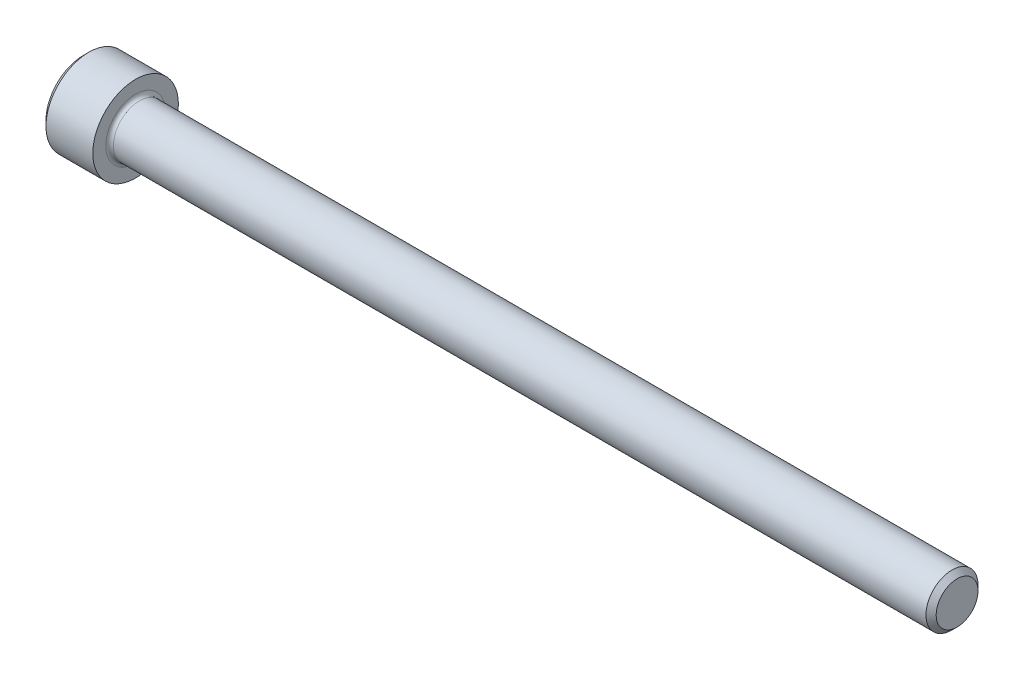
ISO-10303-21;
HEADER;
FILE_DESCRIPTION(('STEP AP214'),'2;1');
FILE_NAME('part.step','',(''),(''),'','','');
FILE_SCHEMA(('AUTOMOTIVE_DESIGN { 1 0 10303 214 1 1 1 1 }'));
ENDSEC;
DATA;
#1=APPLICATION_CONTEXT('core data for automotive mechanical design processes');
#2=APPLICATION_PROTOCOL_DEFINITION('international standard','automotive_design',2000,#1);
#3=PRODUCT_CONTEXT('',#1,'mechanical');
#4=PRODUCT('Part','Part','',(#3));
#5=PRODUCT_RELATED_PRODUCT_CATEGORY('part','',(#4));
#6=PRODUCT_DEFINITION_FORMATION('','',#4);
#7=PRODUCT_DEFINITION_CONTEXT('part definition',#1,'design');
#8=PRODUCT_DEFINITION('design','',#6,#7);
#9=PRODUCT_DEFINITION_SHAPE('','',#8);
#10=(LENGTH_UNIT() NAMED_UNIT(*) SI_UNIT(.MILLI.,.METRE.));
#11=(NAMED_UNIT(*) PLANE_ANGLE_UNIT() SI_UNIT($,.RADIAN.));
#12=(NAMED_UNIT(*) SI_UNIT($,.STERADIAN.) SOLID_ANGLE_UNIT());
#13=UNCERTAINTY_MEASURE_WITH_UNIT(LENGTH_MEASURE(1.E-05),#10,'distance_accuracy_value','');
#14=(GEOMETRIC_REPRESENTATION_CONTEXT(3) GLOBAL_UNCERTAINTY_ASSIGNED_CONTEXT((#13)) GLOBAL_UNIT_ASSIGNED_CONTEXT((#10,
#11,#12)) REPRESENTATION_CONTEXT('',''));
#15=CARTESIAN_POINT('',(0.,0.,0.));
#16=DIRECTION('',(0.,0.,1.));
#17=DIRECTION('',(1.,0.,0.));
#18=AXIS2_PLACEMENT_3D('',#15,#16,#17);
#19=CARTESIAN_POINT('',(2.286,1.14604605784411,1.98501));
#20=DIRECTION('',(-1.,0.,0.));
#21=DIRECTION('',(0.,0.,1.));
#22=AXIS2_PLACEMENT_3D('',#19,#20,#21);
#23=PLANE('',#22);
#24=DIRECTION('',(0.,0.5,0.866025403784439));
#25=VECTOR('',#24,1.);
#26=CARTESIAN_POINT('',(2.286,-1.71906908676614,0.992505));
#27=LINE('',#26,#25);
#28=CARTESIAN_POINT('',(2.285999999976,-1.71906908679011,0.99250500001384));
#29=VERTEX_POINT('',#28);
#30=CARTESIAN_POINT('',(2.286,-1.14604605784409,1.98501));
#31=VERTEX_POINT('',#30);
#32=EDGE_CURVE('E101',#29,#31,#27,.T.);
#33=ORIENTED_EDGE('',*,*,#32,.T.);
#34=DIRECTION('',(0.,1.,0.));
#35=VECTOR('',#34,1.);
#36=CARTESIAN_POINT('',(2.286,1.14604605784411,1.98501));
#37=LINE('',#36,#35);
#38=CARTESIAN_POINT('',(2.28600000001103,0.,1.98500999997046));
#39=VERTEX_POINT('',#38);
#40=EDGE_CURVE('E96',#31,#39,#37,.T.);
#41=ORIENTED_EDGE('',*,*,#40,.T.);
#42=CARTESIAN_POINT('',(2.285999999952,0.,0.));
#43=DIRECTION('',(-1.,0.,0.));
#44=DIRECTION('',(0.,0.,1.));
#45=AXIS2_PLACEMENT_3D('',#42,#43,#44);
#46=CIRCLE('',#45,1.98501000005535);
#47=EDGE_CURVE('E98',#39,#29,#46,.F.);
#48=ORIENTED_EDGE('',*,*,#47,.T.);
#49=EDGE_LOOP('',(#33,#41,#48));
#50=FACE_BOUND('',#49,.T.);
#51=ADVANCED_FACE('F17',(#50),#23,.T.);
#52=CARTESIAN_POINT('',(2.286,1.14604605784411,1.98501));
#53=DIRECTION('',(-1.,0.,0.));
#54=DIRECTION('',(0.,0.,1.));
#55=AXIS2_PLACEMENT_3D('',#52,#53,#54);
#56=PLANE('',#55);
#57=DIRECTION('',(0.,-0.5,0.866025403784439));
#58=VECTOR('',#57,1.);
#59=CARTESIAN_POINT('',(2.286,-1.71906908676615,-0.992505));
#60=LINE('',#59,#58);
#61=CARTESIAN_POINT('',(2.285999999976,-1.71906908679012,-0.992505000013838));
#62=VERTEX_POINT('',#61);
#63=CARTESIAN_POINT('',(2.286,-2.2920921156882,0.));
#64=VERTEX_POINT('',#63);
#65=EDGE_CURVE('E105',#62,#64,#60,.T.);
#66=ORIENTED_EDGE('',*,*,#65,.T.);
#67=DIRECTION('',(0.,0.500000000000008,0.866025403784434));
#68=VECTOR('',#67,1.);
#69=CARTESIAN_POINT('',(2.286,-2.2920921156882,0.));
#70=LINE('',#69,#68);
#71=EDGE_CURVE('E172',#64,#29,#70,.T.);
#72=ORIENTED_EDGE('',*,*,#71,.T.);
#73=CARTESIAN_POINT('',(2.285999999952,0.,0.));
#74=DIRECTION('',(-1.,0.,0.));
#75=DIRECTION('',(0.,0.,1.));
#76=AXIS2_PLACEMENT_3D('',#73,#74,#75);
#77=CIRCLE('',#76,1.98501000005535);
#78=EDGE_CURVE('E117',#29,#62,#77,.F.);
#79=ORIENTED_EDGE('',*,*,#78,.T.);
#80=EDGE_LOOP('',(#66,#72,#79));
#81=FACE_BOUND('',#80,.T.);
#82=ADVANCED_FACE('F348',(#81),#56,.T.);
#83=CARTESIAN_POINT('',(2.286,1.14604605784411,1.98501));
#84=DIRECTION('',(-1.,0.,0.));
#85=DIRECTION('',(0.,0.,1.));
#86=AXIS2_PLACEMENT_3D('',#83,#84,#85);
#87=PLANE('',#86);
#88=DIRECTION('',(0.,1.,0.));
#89=VECTOR('',#88,1.);
#90=CARTESIAN_POINT('',(2.286,1.14604605784411,-1.98501));
#91=LINE('',#90,#89);
#92=CARTESIAN_POINT('',(2.28600000001103,3.76757339419936E-12,-1.98500999997046));
#93=VERTEX_POINT('',#92);
#94=CARTESIAN_POINT('',(2.286,-1.1460460578441,-1.98501));
#95=VERTEX_POINT('',#94);
#96=EDGE_CURVE('E167',#93,#95,#91,.F.);
#97=ORIENTED_EDGE('',*,*,#96,.T.);
#98=DIRECTION('',(0.,-0.5,0.866025403784439));
#99=VECTOR('',#98,1.);
#100=CARTESIAN_POINT('',(2.286,-1.1460460578441,-1.98501));
#101=LINE('',#100,#99);
#102=EDGE_CURVE('E162',#95,#62,#101,.T.);
#103=ORIENTED_EDGE('',*,*,#102,.T.);
#104=CARTESIAN_POINT('',(2.285999999952,0.,0.));
#105=DIRECTION('',(-1.,0.,0.));
#106=DIRECTION('',(0.,0.,1.));
#107=AXIS2_PLACEMENT_3D('',#104,#105,#106);
#108=CIRCLE('',#107,1.98501000005535);
#109=EDGE_CURVE('E225',#62,#93,#108,.F.);
#110=ORIENTED_EDGE('',*,*,#109,.T.);
#111=EDGE_LOOP('',(#97,#103,#110));
#112=FACE_BOUND('',#111,.T.);
#113=ADVANCED_FACE('F345',(#112),#87,.T.);
#114=CARTESIAN_POINT('',(2.286,1.14604605784411,1.98501));
#115=DIRECTION('',(-1.,0.,0.));
#116=DIRECTION('',(0.,0.,1.));
#117=AXIS2_PLACEMENT_3D('',#114,#115,#116);
#118=PLANE('',#117);
#119=DIRECTION('',(0.,-0.5,-0.866025403784439));
#120=VECTOR('',#119,1.);
#121=CARTESIAN_POINT('',(2.286,1.71906908676615,-0.992505));
#122=LINE('',#121,#120);
#123=CARTESIAN_POINT('',(2.285999999976,1.71906908679012,-0.992505000013838));
#124=VERTEX_POINT('',#123);
#125=CARTESIAN_POINT('',(2.286,1.1460460578441,-1.98501));
#126=VERTEX_POINT('',#125);
#127=EDGE_CURVE('E157',#124,#126,#122,.T.);
#128=ORIENTED_EDGE('',*,*,#127,.T.);
#129=DIRECTION('',(0.,1.,0.));
#130=VECTOR('',#129,1.);
#131=CARTESIAN_POINT('',(2.286,1.14604605784411,-1.98501));
#132=LINE('',#131,#130);
#133=EDGE_CURVE('E152',#126,#93,#132,.F.);
#134=ORIENTED_EDGE('',*,*,#133,.T.);
#135=CARTESIAN_POINT('',(2.285999999952,0.,0.));
#136=DIRECTION('',(-1.,0.,0.));
#137=DIRECTION('',(0.,0.,1.));
#138=AXIS2_PLACEMENT_3D('',#135,#136,#137);
#139=CIRCLE('',#138,1.98501000005535);
#140=EDGE_CURVE('E222',#93,#124,#139,.F.);
#141=ORIENTED_EDGE('',*,*,#140,.T.);
#142=EDGE_LOOP('',(#128,#134,#141));
#143=FACE_BOUND('',#142,.T.);
#144=ADVANCED_FACE('F341',(#143),#118,.T.);
#145=CARTESIAN_POINT('',(2.286,1.14604605784411,1.98501));
#146=DIRECTION('',(-1.,0.,0.));
#147=DIRECTION('',(0.,0.,1.));
#148=AXIS2_PLACEMENT_3D('',#145,#146,#147);
#149=PLANE('',#148);
#150=DIRECTION('',(0.,0.500000000000005,-0.866025403784436));
#151=VECTOR('',#150,1.);
#152=CARTESIAN_POINT('',(2.286,1.71906908676615,0.992505));
#153=LINE('',#152,#151);
#154=CARTESIAN_POINT('',(2.285999999976,1.71906908679012,0.992505000013838));
#155=VERTEX_POINT('',#154);
#156=CARTESIAN_POINT('',(2.286,2.29209211568821,0.));
#157=VERTEX_POINT('',#156);
#158=EDGE_CURVE('E147',#155,#157,#153,.T.);
#159=ORIENTED_EDGE('',*,*,#158,.T.);
#160=DIRECTION('',(0.,-0.500000000000009,-0.866025403784434));
#161=VECTOR('',#160,1.);
#162=CARTESIAN_POINT('',(2.286,2.29209211568821,0.));
#163=LINE('',#162,#161);
#164=EDGE_CURVE('E118',#157,#124,#163,.T.);
#165=ORIENTED_EDGE('',*,*,#164,.T.);
#166=CARTESIAN_POINT('',(2.285999999952,0.,0.));
#167=DIRECTION('',(-1.,0.,0.));
#168=DIRECTION('',(0.,0.,1.));
#169=AXIS2_PLACEMENT_3D('',#166,#167,#168);
#170=CIRCLE('',#169,1.98501000005535);
#171=EDGE_CURVE('E125',#124,#155,#170,.F.);
#172=ORIENTED_EDGE('',*,*,#171,.T.);
#173=EDGE_LOOP('',(#159,#165,#172));
#174=FACE_BOUND('',#173,.T.);
#175=ADVANCED_FACE('F337',(#174),#149,.T.);
#176=CARTESIAN_POINT('',(2.28600000008328,0.,0.));
#177=DIRECTION('',(-1.,0.,0.));
#178=DIRECTION('',(0.,0.,1.));
#179=AXIS2_PLACEMENT_3D('',#176,#177,#178);
#180=CONICAL_SURFACE('',#179,1.98500999982798,1.04719755104307);
#181=CARTESIAN_POINT('',(3.43204605781011,0.,5.6843418860808E-11));
#182=VERTEX_POINT('',#181);
#183=VERTEX_LOOP('',#182);
#184=FACE_BOUND('',#183,.T.);
#185=ORIENTED_EDGE('',*,*,#47,.F.);
#186=CARTESIAN_POINT('',(2.285999999952,0.,0.));
#187=DIRECTION('',(-1.,0.,0.));
#188=DIRECTION('',(0.,0.,1.));
#189=AXIS2_PLACEMENT_3D('',#186,#187,#188);
#190=CIRCLE('',#189,1.98501000005535);
#191=EDGE_CURVE('E113',#155,#39,#190,.F.);
#192=ORIENTED_EDGE('',*,*,#191,.F.);
#193=ORIENTED_EDGE('',*,*,#171,.F.);
#194=ORIENTED_EDGE('',*,*,#140,.F.);
#195=ORIENTED_EDGE('',*,*,#109,.F.);
#196=ORIENTED_EDGE('',*,*,#78,.F.);
#197=EDGE_LOOP('',(#185,#192,#193,#194,#195,#196));
#198=FACE_BOUND('',#197,.T.);
#199=ADVANCED_FACE('F111',(#184,#198),#180,.F.);
#200=CARTESIAN_POINT('',(2.286,1.14604605784411,1.98501));
#201=DIRECTION('',(-1.,0.,0.));
#202=DIRECTION('',(0.,0.,1.));
#203=AXIS2_PLACEMENT_3D('',#200,#201,#202);
#204=PLANE('',#203);
#205=DIRECTION('',(0.,-1.,0.));
#206=VECTOR('',#205,1.);
#207=CARTESIAN_POINT('',(2.286,-1.14604605784409,1.98501));
#208=LINE('',#207,#206);
#209=CARTESIAN_POINT('',(2.286,1.14604605784411,1.98501));
#210=VERTEX_POINT('',#209);
#211=EDGE_CURVE('E122',#39,#210,#208,.F.);
#212=ORIENTED_EDGE('',*,*,#211,.T.);
#213=DIRECTION('',(0.,0.5,-0.866025403784439));
#214=VECTOR('',#213,1.);
#215=CARTESIAN_POINT('',(2.286,2.29209211568821,0.));
#216=LINE('',#215,#214);
#217=EDGE_CURVE('E124',#155,#210,#216,.F.);
#218=ORIENTED_EDGE('',*,*,#217,.F.);
#219=ORIENTED_EDGE('',*,*,#191,.T.);
#220=EDGE_LOOP('',(#212,#218,#219));
#221=FACE_BOUND('',#220,.T.);
#222=ADVANCED_FACE('F121',(#221),#204,.T.);
#223=CARTESIAN_POINT('',(2.286,2.29209211568821,0.));
#224=DIRECTION('',(0.,-0.866025403784439,-0.5));
#225=DIRECTION('',(0.,0.5,-0.866025403784439));
#226=AXIS2_PLACEMENT_3D('',#223,#224,#225);
#227=PLANE('',#226);
#228=ORIENTED_EDGE('',*,*,#217,.T.);
#229=DIRECTION('',(1.,0.,0.));
#230=VECTOR('',#229,1.);
#231=CARTESIAN_POINT('',(2.286,1.14604605784411,1.98501));
#232=LINE('',#231,#230);
#233=CARTESIAN_POINT('',(0.,1.14604605784411,1.98501));
#234=VERTEX_POINT('',#233);
#235=EDGE_CURVE('E130',#210,#234,#232,.F.);
#236=ORIENTED_EDGE('',*,*,#235,.T.);
#237=DIRECTION('',(0.,-0.499999999999999,0.866025403784439));
#238=VECTOR('',#237,1.);
#239=CARTESIAN_POINT('',(0.,2.29209211568821,0.));
#240=LINE('',#239,#238);
#241=CARTESIAN_POINT('',(0.,2.29209211568821,0.));
#242=VERTEX_POINT('',#241);
#243=EDGE_CURVE('E137',#242,#234,#240,.T.);
#244=ORIENTED_EDGE('',*,*,#243,.F.);
#245=DIRECTION('',(1.,0.,0.));
#246=VECTOR('',#245,1.);
#247=CARTESIAN_POINT('',(2.286,2.29209211568821,0.));
#248=LINE('',#247,#246);
#249=EDGE_CURVE('E187',#242,#157,#248,.T.);
#250=ORIENTED_EDGE('',*,*,#249,.T.);
#251=ORIENTED_EDGE('',*,*,#158,.F.);
#252=EDGE_LOOP('',(#228,#236,#244,#250,#251));
#253=FACE_BOUND('',#252,.T.);
#254=ADVANCED_FACE('F329',(#253),#227,.T.);
#255=CARTESIAN_POINT('',(2.286,-1.14604605784409,1.98501));
#256=DIRECTION('',(0.,0.,1.));
#257=DIRECTION('',(0.,-1.,0.));
#258=AXIS2_PLACEMENT_3D('',#255,#256,#257);
#259=PLANE('',#258);
#260=ORIENTED_EDGE('',*,*,#235,.F.);
#261=ORIENTED_EDGE('',*,*,#211,.F.);
#262=ORIENTED_EDGE('',*,*,#40,.F.);
#263=DIRECTION('',(1.,0.,0.));
#264=VECTOR('',#263,1.);
#265=CARTESIAN_POINT('',(2.286,-1.14604605784409,1.98501));
#266=LINE('',#265,#264);
#267=CARTESIAN_POINT('',(0.,-1.14604605784409,1.98501));
#268=VERTEX_POINT('',#267);
#269=EDGE_CURVE('E132',#268,#31,#266,.T.);
#270=ORIENTED_EDGE('',*,*,#269,.F.);
#271=DIRECTION('',(0.,1.,0.));
#272=VECTOR('',#271,1.);
#273=CARTESIAN_POINT('',(0.,0.,1.98501));
#274=LINE('',#273,#272);
#275=EDGE_CURVE('E363',#234,#268,#274,.F.);
#276=ORIENTED_EDGE('',*,*,#275,.F.);
#277=EDGE_LOOP('',(#260,#261,#262,#270,#276));
#278=FACE_BOUND('',#277,.T.);
#279=ADVANCED_FACE('F128',(#278),#259,.F.);
#280=CARTESIAN_POINT('',(2.286,-1.14604605784409,1.98501));
#281=DIRECTION('',(0.,0.866025403784438,-0.5));
#282=DIRECTION('',(0.,0.5,0.866025403784438));
#283=AXIS2_PLACEMENT_3D('',#280,#281,#282);
#284=PLANE('',#283);
#285=ORIENTED_EDGE('',*,*,#71,.F.);
#286=DIRECTION('',(1.,0.,0.));
#287=VECTOR('',#286,1.);
#288=CARTESIAN_POINT('',(2.286,-2.2920921156882,0.));
#289=LINE('',#288,#287);
#290=CARTESIAN_POINT('',(0.,-2.2920921156882,0.));
#291=VERTEX_POINT('',#290);
#292=EDGE_CURVE('E198',#291,#64,#289,.T.);
#293=ORIENTED_EDGE('',*,*,#292,.F.);
#294=DIRECTION('',(0.,-0.500000000000004,-0.866025403784436));
#295=VECTOR('',#294,1.);
#296=CARTESIAN_POINT('',(0.,-1.14604605784409,1.98501));
#297=LINE('',#296,#295);
#298=EDGE_CURVE('E361',#268,#291,#297,.T.);
#299=ORIENTED_EDGE('',*,*,#298,.F.);
#300=ORIENTED_EDGE('',*,*,#269,.T.);
#301=ORIENTED_EDGE('',*,*,#32,.F.);
#302=EDGE_LOOP('',(#285,#293,#299,#300,#301));
#303=FACE_BOUND('',#302,.T.);
#304=ADVANCED_FACE('F322',(#303),#284,.T.);
#305=CARTESIAN_POINT('',(2.286,-2.2920921156882,0.));
#306=DIRECTION('',(0.,0.866025403784439,0.499999999999999));
#307=DIRECTION('',(0.,-0.499999999999999,0.866025403784439));
#308=AXIS2_PLACEMENT_3D('',#305,#306,#307);
#309=PLANE('',#308);
#310=ORIENTED_EDGE('',*,*,#102,.F.);
#311=DIRECTION('',(1.,0.,0.));
#312=VECTOR('',#311,1.);
#313=CARTESIAN_POINT('',(2.286,-1.1460460578441,-1.98501));
#314=LINE('',#313,#312);
#315=CARTESIAN_POINT('',(0.,-1.1460460578441,-1.98501));
#316=VERTEX_POINT('',#315);
#317=EDGE_CURVE('E191',#95,#316,#314,.F.);
#318=ORIENTED_EDGE('',*,*,#317,.T.);
#319=DIRECTION('',(0.,0.5,-0.866025403784439));
#320=VECTOR('',#319,1.);
#321=CARTESIAN_POINT('',(0.,-2.2920921156882,0.));
#322=LINE('',#321,#320);
#323=EDGE_CURVE('E358',#291,#316,#322,.T.);
#324=ORIENTED_EDGE('',*,*,#323,.F.);
#325=ORIENTED_EDGE('',*,*,#292,.T.);
#326=ORIENTED_EDGE('',*,*,#65,.F.);
#327=EDGE_LOOP('',(#310,#318,#324,#325,#326));
#328=FACE_BOUND('',#327,.T.);
#329=ADVANCED_FACE('F318',(#328),#309,.T.);
#330=CARTESIAN_POINT('',(2.286,1.1460460578441,-1.98501));
#331=DIRECTION('',(0.,0.,-1.));
#332=DIRECTION('',(0.,1.,0.));
#333=AXIS2_PLACEMENT_3D('',#330,#331,#332);
#334=PLANE('',#333);
#335=ORIENTED_EDGE('',*,*,#317,.F.);
#336=ORIENTED_EDGE('',*,*,#96,.F.);
#337=ORIENTED_EDGE('',*,*,#133,.F.);
#338=DIRECTION('',(1.,0.,0.));
#339=VECTOR('',#338,1.);
#340=CARTESIAN_POINT('',(2.286,1.14604605784411,-1.98501000000001));
#341=LINE('',#340,#339);
#342=CARTESIAN_POINT('',(0.,1.1460460578441,-1.98501));
#343=VERTEX_POINT('',#342);
#344=EDGE_CURVE('E190',#126,#343,#341,.F.);
#345=ORIENTED_EDGE('',*,*,#344,.T.);
#346=DIRECTION('',(0.,1.,0.));
#347=VECTOR('',#346,1.);
#348=CARTESIAN_POINT('',(0.,0.,-1.98501));
#349=LINE('',#348,#347);
#350=EDGE_CURVE('E373',#316,#343,#349,.T.);
#351=ORIENTED_EDGE('',*,*,#350,.F.);
#352=EDGE_LOOP('',(#335,#336,#337,#345,#351));
#353=FACE_BOUND('',#352,.T.);
#354=ADVANCED_FACE('F314',(#353),#334,.F.);
#355=CARTESIAN_POINT('',(2.286,2.29209211568821,0.));
#356=DIRECTION('',(0.,0.866025403784438,-0.5));
#357=DIRECTION('',(0.,0.5,0.866025403784438));
#358=AXIS2_PLACEMENT_3D('',#355,#356,#357);
#359=PLANE('',#358);
#360=ORIENTED_EDGE('',*,*,#344,.F.);
#361=ORIENTED_EDGE('',*,*,#127,.F.);
#362=ORIENTED_EDGE('',*,*,#164,.F.);
#363=ORIENTED_EDGE('',*,*,#249,.F.);
#364=DIRECTION('',(0.,0.500000000000004,0.866025403784436));
#365=VECTOR('',#364,1.);
#366=CARTESIAN_POINT('',(0.,1.1460460578441,-1.98501));
#367=LINE('',#366,#365);
#368=EDGE_CURVE('E218',#343,#242,#367,.T.);
#369=ORIENTED_EDGE('',*,*,#368,.F.);
#370=EDGE_LOOP('',(#360,#361,#362,#363,#369));
#371=FACE_BOUND('',#370,.T.);
#372=ADVANCED_FACE('F310',(#371),#359,.F.);
#373=CARTESIAN_POINT('',(0.,0.,0.));
#374=DIRECTION('',(-1.,0.,0.));
#375=DIRECTION('',(0.,0.,1.));
#376=AXIS2_PLACEMENT_3D('',#373,#374,#375);
#377=PLANE('',#376);
#378=CARTESIAN_POINT('',(-5.6843418860808E-11,0.,0.));
#379=DIRECTION('',(1.,0.,0.));
#380=DIRECTION('',(0.,1.,0.));
#381=AXIS2_PLACEMENT_3D('',#378,#379,#380);
#382=CIRCLE('',#381,3.48615000001473);
#383=CARTESIAN_POINT('',(-5.68434426698877E-11,3.48615000001473,0.));
#384=VERTEX_POINT('',#383);
#385=EDGE_CURVE('E216',#384,#384,#382,.T.);
#386=ORIENTED_EDGE('',*,*,#385,.F.);
#387=EDGE_LOOP('',(#386));
#388=FACE_BOUND('',#387,.T.);
#389=ORIENTED_EDGE('',*,*,#350,.T.);
#390=ORIENTED_EDGE('',*,*,#368,.T.);
#391=ORIENTED_EDGE('',*,*,#243,.T.);
#392=ORIENTED_EDGE('',*,*,#275,.T.);
#393=ORIENTED_EDGE('',*,*,#298,.T.);
#394=ORIENTED_EDGE('',*,*,#323,.T.);
#395=EDGE_LOOP('',(#389,#390,#391,#392,#393,#394));
#396=FACE_BOUND('',#395,.T.);
#397=ADVANCED_FACE('F302',(#388,#396),#377,.T.);
#398=CARTESIAN_POINT('',(0.482599999998001,0.,0.));
#399=DIRECTION('',(1.,0.,0.));
#400=DIRECTION('',(0.,1.,0.));
#401=AXIS2_PLACEMENT_3D('',#398,#399,#400);
#402=CONICAL_SURFACE('',#401,3.96875000006958,0.785398163397448);
#403=ORIENTED_EDGE('',*,*,#385,.T.);
#404=EDGE_LOOP('',(#403));
#405=FACE_BOUND('',#404,.T.);
#406=CARTESIAN_POINT('',(0.4826,0.,0.));
#407=DIRECTION('',(1.,0.,0.));
#408=DIRECTION('',(0.,0.,-1.));
#409=AXIS2_PLACEMENT_3D('',#406,#407,#408);
#410=CIRCLE('',#409,3.96875);
#411=CARTESIAN_POINT('',(0.4826,0.,-3.96875));
#412=VERTEX_POINT('',#411);
#413=EDGE_CURVE('E215',#412,#412,#410,.T.);
#414=ORIENTED_EDGE('',*,*,#413,.F.);
#415=EDGE_LOOP('',(#414));
#416=FACE_BOUND('',#415,.T.);
#417=ADVANCED_FACE('F297',(#405,#416),#402,.T.);
#418=CARTESIAN_POINT('',(-31.75,0.,0.));
#419=DIRECTION('',(1.,0.,0.));
#420=DIRECTION('',(0.,0.,-1.));
#421=AXIS2_PLACEMENT_3D('',#418,#419,#420);
#422=CYLINDRICAL_SURFACE('',#421,3.96875);
#423=CARTESIAN_POINT('',(4.826,0.,0.));
#424=DIRECTION('',(1.,0.,0.));
#425=DIRECTION('',(0.,0.,-1.));
#426=AXIS2_PLACEMENT_3D('',#423,#424,#425);
#427=CIRCLE('',#426,3.96875);
#428=CARTESIAN_POINT('',(4.826,0.,-3.96875));
#429=VERTEX_POINT('',#428);
#430=EDGE_CURVE('E212',#429,#429,#427,.T.);
#431=ORIENTED_EDGE('',*,*,#430,.F.);
#432=EDGE_LOOP('',(#431));
#433=FACE_BOUND('',#432,.T.);
#434=ORIENTED_EDGE('',*,*,#413,.T.);
#435=EDGE_LOOP('',(#434));
#436=FACE_BOUND('',#435,.T.);
#437=ADVANCED_FACE('F293',(#433,#436),#422,.T.);
#438=CARTESIAN_POINT('',(81.026,1.94056,0.));
#439=DIRECTION('',(1.,0.,0.));
#440=DIRECTION('',(0.,0.,-1.));
#441=AXIS2_PLACEMENT_3D('',#438,#439,#440);
#442=PLANE('',#441);
#443=CARTESIAN_POINT('',(81.0259999999516,0.,0.));
#444=DIRECTION('',(-1.,0.,0.));
#445=DIRECTION('',(0.,0.,1.));
#446=AXIS2_PLACEMENT_3D('',#443,#444,#445);
#447=CIRCLE('',#446,1.94055999998);
#448=CARTESIAN_POINT('',(81.0259999999516,0.,1.94055999998));
#449=VERTEX_POINT('',#448);
#450=EDGE_CURVE('E208',#449,#449,#447,.T.);
#451=ORIENTED_EDGE('',*,*,#450,.F.);
#452=EDGE_LOOP('',(#451));
#453=FACE_BOUND('',#452,.T.);
#454=ADVANCED_FACE('F251',(#453),#442,.T.);
#455=CARTESIAN_POINT('',(4.826,3.96875,0.));
#456=DIRECTION('',(1.,0.,0.));
#457=DIRECTION('',(0.,0.,-1.));
#458=AXIS2_PLACEMENT_3D('',#455,#456,#457);
#459=PLANE('',#458);
#460=ORIENTED_EDGE('',*,*,#430,.T.);
#461=EDGE_LOOP('',(#460));
#462=FACE_BOUND('',#461,.T.);
#463=CARTESIAN_POINT('',(4.826,0.,0.));
#464=DIRECTION('',(1.,0.,0.));
#465=DIRECTION('',(0.,0.,1.));
#466=AXIS2_PLACEMENT_3D('',#463,#464,#465);
#467=CIRCLE('',#466,2.7686);
#468=CARTESIAN_POINT('',(4.826,0.,-2.7686));
#469=VERTEX_POINT('',#468);
#470=CARTESIAN_POINT('',(4.826,0.,2.7686));
#471=VERTEX_POINT('',#470);
#472=EDGE_CURVE('E211',#469,#471,#467,.F.);
#473=ORIENTED_EDGE('',*,*,#472,.T.);
#474=CARTESIAN_POINT('',(4.826,0.,0.));
#475=DIRECTION('',(1.,0.,0.));
#476=DIRECTION('',(0.,0.,-1.));
#477=AXIS2_PLACEMENT_3D('',#474,#475,#476);
#478=CIRCLE('',#477,2.7686);
#479=EDGE_CURVE('E36',#471,#469,#478,.F.);
#480=ORIENTED_EDGE('',*,*,#479,.T.);
#481=EDGE_LOOP('',(#473,#480));
#482=FACE_BOUND('',#481,.T.);
#483=ADVANCED_FACE('F232',(#462,#482),#459,.T.);
#484=CARTESIAN_POINT('',(80.5535599999416,0.,0.));
#485=DIRECTION('',(-1.,0.,0.));
#486=DIRECTION('',(0.,0.,1.));
#487=AXIS2_PLACEMENT_3D('',#484,#485,#486);
#488=CONICAL_SURFACE('',#487,2.41300000004685,0.785398163457608);
#489=CARTESIAN_POINT('',(80.55356,0.,0.));
#490=DIRECTION('',(1.,0.,0.));
#491=DIRECTION('',(0.,0.,-1.));
#492=AXIS2_PLACEMENT_3D('',#489,#490,#491);
#493=CIRCLE('',#492,2.413);
#494=CARTESIAN_POINT('',(80.55356,0.,-2.413));
#495=VERTEX_POINT('',#494);
#496=EDGE_CURVE('E28',#495,#495,#493,.F.);
#497=ORIENTED_EDGE('',*,*,#496,.F.);
#498=EDGE_LOOP('',(#497));
#499=FACE_BOUND('',#498,.T.);
#500=ORIENTED_EDGE('',*,*,#450,.T.);
#501=EDGE_LOOP('',(#500));
#502=FACE_BOUND('',#501,.T.);
#503=ADVANCED_FACE('F250',(#499,#502),#488,.T.);
#504=CARTESIAN_POINT('',(5.1816,0.,0.));
#505=DIRECTION('',(1.,0.,0.));
#506=DIRECTION('',(0.,0.,-1.));
#507=AXIS2_PLACEMENT_3D('',#504,#505,#506);
#508=TOROIDAL_SURFACE('',#507,2.7686,0.3556);
#509=CARTESIAN_POINT('',(5.1816,0.,0.));
#510=DIRECTION('',(1.,0.,0.));
#511=DIRECTION('',(0.,0.,-1.));
#512=AXIS2_PLACEMENT_3D('',#509,#510,#511);
#513=CIRCLE('',#512,2.413);
#514=CARTESIAN_POINT('',(5.1816,0.,-2.413));
#515=VERTEX_POINT('',#514);
#516=EDGE_CURVE('E11',#515,#515,#513,.T.);
#517=ORIENTED_EDGE('',*,*,#516,.F.);
#518=EDGE_LOOP('',(#517));
#519=FACE_BOUND('',#518,.T.);
#520=ORIENTED_EDGE('',*,*,#472,.F.);
#521=ORIENTED_EDGE('',*,*,#479,.F.);
#522=EDGE_LOOP('',(#520,#521));
#523=FACE_BOUND('',#522,.T.);
#524=ADVANCED_FACE('F229',(#519,#523),#508,.F.);
#525=CARTESIAN_POINT('',(-31.75,0.,0.));
#526=DIRECTION('',(1.,0.,0.));
#527=DIRECTION('',(0.,0.,-1.));
#528=AXIS2_PLACEMENT_3D('',#525,#526,#527);
#529=CYLINDRICAL_SURFACE('',#528,2.413);
#530=ORIENTED_EDGE('',*,*,#516,.T.);
#531=EDGE_LOOP('',(#530));
#532=FACE_BOUND('',#531,.T.);
#533=ORIENTED_EDGE('',*,*,#496,.T.);
#534=EDGE_LOOP('',(#533));
#535=FACE_BOUND('',#534,.T.);
#536=ADVANCED_FACE('F275',(#532,#535),#529,.T.);
#537=CLOSED_SHELL('',(#51,#82,#113,#144,#175,#199,#222,#254,#279,#304,#329,#354,#372,#397,#417,
#437,#454,#483,#503,#524,#536));
#538=MANIFOLD_SOLID_BREP('B1',#537);
#539=ADVANCED_BREP_SHAPE_REPRESENTATION('',(#18,#538),#14);
#540=SHAPE_DEFINITION_REPRESENTATION(#9,#539);
ENDSEC;
END-ISO-10303-21;
